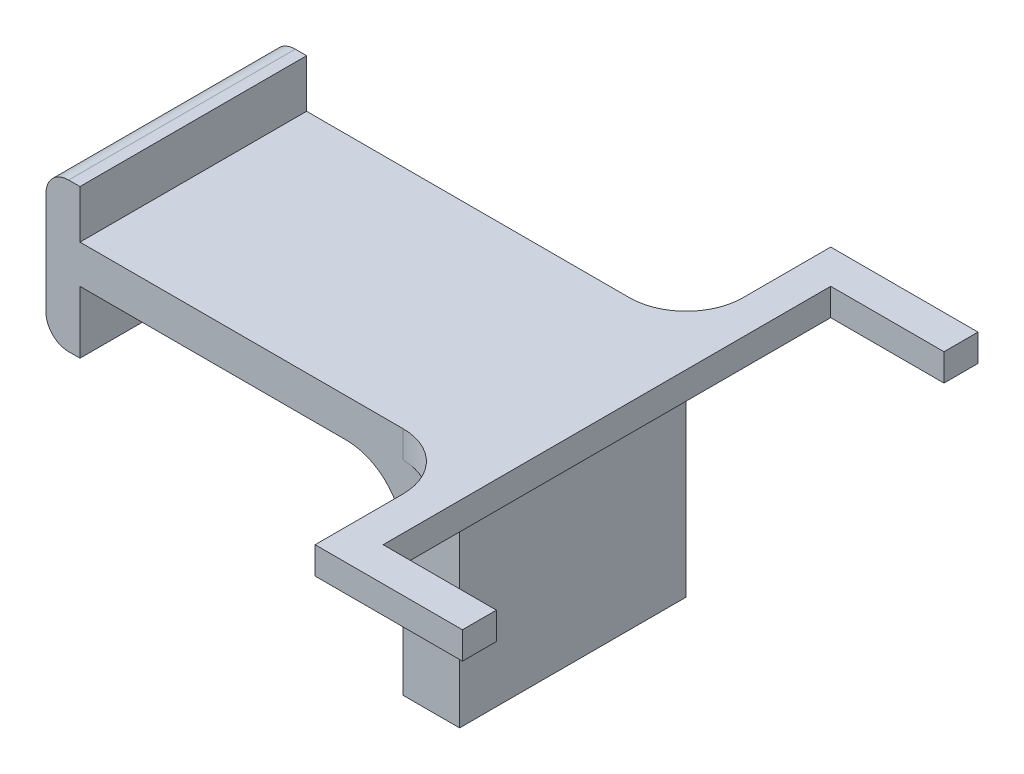
ISO-10303-21;
HEADER;
FILE_DESCRIPTION(('STEP AP214'),'2;1');
FILE_NAME('part.step','',(''),(''),'','','');
FILE_SCHEMA(('AUTOMOTIVE_DESIGN { 1 0 10303 214 1 1 1 1 }'));
ENDSEC;
DATA;
#1=APPLICATION_CONTEXT('core data for automotive mechanical design processes');
#2=APPLICATION_PROTOCOL_DEFINITION('international standard','automotive_design',2000,#1);
#3=PRODUCT_CONTEXT('',#1,'mechanical');
#4=PRODUCT('Part','Part','',(#3));
#5=PRODUCT_RELATED_PRODUCT_CATEGORY('part','',(#4));
#6=PRODUCT_DEFINITION_FORMATION('','',#4);
#7=PRODUCT_DEFINITION_CONTEXT('part definition',#1,'design');
#8=PRODUCT_DEFINITION('design','',#6,#7);
#9=PRODUCT_DEFINITION_SHAPE('','',#8);
#10=(LENGTH_UNIT() NAMED_UNIT(*) SI_UNIT(.MILLI.,.METRE.));
#11=(NAMED_UNIT(*) PLANE_ANGLE_UNIT() SI_UNIT($,.RADIAN.));
#12=(NAMED_UNIT(*) SI_UNIT($,.STERADIAN.) SOLID_ANGLE_UNIT());
#13=UNCERTAINTY_MEASURE_WITH_UNIT(LENGTH_MEASURE(1.E-05),#10,'distance_accuracy_value','');
#14=(GEOMETRIC_REPRESENTATION_CONTEXT(3) GLOBAL_UNCERTAINTY_ASSIGNED_CONTEXT((#13)) GLOBAL_UNIT_ASSIGNED_CONTEXT((#10,
#11,#12)) REPRESENTATION_CONTEXT('',''));
#15=CARTESIAN_POINT('',(0.,0.,0.));
#16=DIRECTION('',(0.,0.,1.));
#17=DIRECTION('',(1.,0.,0.));
#18=AXIS2_PLACEMENT_3D('',#15,#16,#17);
#19=CARTESIAN_POINT('',(0.,-2.4,-10.));
#20=DIRECTION('',(0.,0.,-1.));
#21=DIRECTION('',(-1.,0.,0.));
#22=AXIS2_PLACEMENT_3D('',#19,#20,#21);
#23=PLANE('',#22);
#24=DIRECTION('',(-1.,0.,0.));
#25=VECTOR('',#24,1.);
#26=CARTESIAN_POINT('',(-46.5,-8.875,-10.));
#27=LINE('',#26,#25);
#28=CARTESIAN_POINT('',(-46.5,-8.875,-10.));
#29=VERTEX_POINT('',#28);
#30=CARTESIAN_POINT('',(-47.5,-8.875,-10.));
#31=VERTEX_POINT('',#30);
#32=EDGE_CURVE('E265',#29,#31,#27,.T.);
#33=ORIENTED_EDGE('',*,*,#32,.T.);
#34=CARTESIAN_POINT('',(-47.5,-6.875,-10.));
#35=DIRECTION('',(0.,0.,-1.));
#36=DIRECTION('',(-1.,0.,0.));
#37=AXIS2_PLACEMENT_3D('',#34,#35,#36);
#38=CIRCLE('',#37,2.);
#39=CARTESIAN_POINT('',(-49.5,-6.875,-10.));
#40=VERTEX_POINT('',#39);
#41=EDGE_CURVE('E390',#31,#40,#38,.T.);
#42=ORIENTED_EDGE('',*,*,#41,.T.);
#43=DIRECTION('',(0.,1.,0.));
#44=VECTOR('',#43,1.);
#45=CARTESIAN_POINT('',(-49.5,-8.875,-10.));
#46=LINE('',#45,#44);
#47=CARTESIAN_POINT('',(-49.5,2.25,-10.));
#48=VERTEX_POINT('',#47);
#49=EDGE_CURVE('E268',#40,#48,#46,.T.);
#50=ORIENTED_EDGE('',*,*,#49,.T.);
#51=CARTESIAN_POINT('',(-47.5,2.25,-10.));
#52=DIRECTION('',(0.,0.,-1.));
#53=DIRECTION('',(-1.,0.,0.));
#54=AXIS2_PLACEMENT_3D('',#51,#52,#53);
#55=CIRCLE('',#54,2.);
#56=CARTESIAN_POINT('',(-47.5,4.25,-10.));
#57=VERTEX_POINT('',#56);
#58=EDGE_CURVE('E388',#48,#57,#55,.T.);
#59=ORIENTED_EDGE('',*,*,#58,.T.);
#60=DIRECTION('',(1.,0.,0.));
#61=VECTOR('',#60,1.);
#62=CARTESIAN_POINT('',(-49.5,4.25,-10.));
#63=LINE('',#62,#61);
#64=CARTESIAN_POINT('',(-46.5,4.25,-10.));
#65=VERTEX_POINT('',#64);
#66=EDGE_CURVE('E233',#57,#65,#63,.T.);
#67=ORIENTED_EDGE('',*,*,#66,.T.);
#68=DIRECTION('',(0.,-1.,0.));
#69=VECTOR('',#68,1.);
#70=CARTESIAN_POINT('',(-46.5,4.25,-10.));
#71=LINE('',#70,#69);
#72=CARTESIAN_POINT('',(-46.5,0.,-10.));
#73=VERTEX_POINT('',#72);
#74=EDGE_CURVE('E230',#65,#73,#71,.T.);
#75=ORIENTED_EDGE('',*,*,#74,.T.);
#76=DIRECTION('',(-1.,0.,0.));
#77=VECTOR('',#76,1.);
#78=CARTESIAN_POINT('',(0.,0.,-10.));
#79=LINE('',#78,#77);
#80=CARTESIAN_POINT('',(-18.,0.,-10.));
#81=VERTEX_POINT('',#80);
#82=EDGE_CURVE('E275',#81,#73,#79,.T.);
#83=ORIENTED_EDGE('',*,*,#82,.F.);
#84=DIRECTION('',(0.,1.,0.));
#85=VECTOR('',#84,1.);
#86=CARTESIAN_POINT('',(-18.,-2.4,-10.));
#87=LINE('',#86,#85);
#88=CARTESIAN_POINT('',(-18.,-2.4,-10.));
#89=VERTEX_POINT('',#88);
#90=EDGE_CURVE('E358',#81,#89,#87,.F.);
#91=ORIENTED_EDGE('',*,*,#90,.T.);
#92=DIRECTION('',(1.,0.,0.));
#93=VECTOR('',#92,1.);
#94=CARTESIAN_POINT('',(0.,-2.4,-10.));
#95=LINE('',#94,#93);
#96=CARTESIAN_POINT('',(-13.,-2.4,-10.));
#97=VERTEX_POINT('',#96);
#98=EDGE_CURVE('E356',#89,#97,#95,.T.);
#99=ORIENTED_EDGE('',*,*,#98,.T.);
#100=DIRECTION('',(0.,-1.,0.));
#101=VECTOR('',#100,1.);
#102=CARTESIAN_POINT('',(-13.,-2.4,-10.));
#103=LINE('',#102,#101);
#104=CARTESIAN_POINT('',(-13.,-20.38,-10.));
#105=VERTEX_POINT('',#104);
#106=EDGE_CURVE('E253',#97,#105,#103,.T.);
#107=ORIENTED_EDGE('',*,*,#106,.T.);
#108=DIRECTION('',(-1.,0.,0.));
#109=VECTOR('',#108,1.);
#110=CARTESIAN_POINT('',(-13.,-20.38,-10.));
#111=LINE('',#110,#109);
#112=CARTESIAN_POINT('',(-18.,-20.38,-10.));
#113=VERTEX_POINT('',#112);
#114=EDGE_CURVE('E211',#105,#113,#111,.T.);
#115=ORIENTED_EDGE('',*,*,#114,.T.);
#116=DIRECTION('',(0.,1.,0.));
#117=VECTOR('',#116,1.);
#118=CARTESIAN_POINT('',(-18.,-20.38,-10.));
#119=LINE('',#118,#117);
#120=CARTESIAN_POINT('',(-18.,-8.38,-10.));
#121=VERTEX_POINT('',#120);
#122=EDGE_CURVE('E256',#113,#121,#119,.T.);
#123=ORIENTED_EDGE('',*,*,#122,.T.);
#124=CARTESIAN_POINT('',(-23.,-8.38,-10.));
#125=DIRECTION('',(0.,0.,-1.));
#126=DIRECTION('',(-1.,0.,0.));
#127=AXIS2_PLACEMENT_3D('',#124,#125,#126);
#128=CIRCLE('',#127,5.);
#129=CARTESIAN_POINT('',(-23.,-3.38,-10.));
#130=VERTEX_POINT('',#129);
#131=EDGE_CURVE('E381',#121,#130,#128,.F.);
#132=ORIENTED_EDGE('',*,*,#131,.T.);
#133=DIRECTION('',(1.,0.,0.));
#134=VECTOR('',#133,1.);
#135=CARTESIAN_POINT('',(-46.5,-3.38,-10.));
#136=LINE('',#135,#134);
#137=CARTESIAN_POINT('',(-46.5,-3.38,-10.));
#138=VERTEX_POINT('',#137);
#139=EDGE_CURVE('E259',#138,#130,#136,.T.);
#140=ORIENTED_EDGE('',*,*,#139,.F.);
#141=DIRECTION('',(0.,-1.,0.));
#142=VECTOR('',#141,1.);
#143=CARTESIAN_POINT('',(-46.5,-3.38,-10.));
#144=LINE('',#143,#142);
#145=EDGE_CURVE('E262',#138,#29,#144,.T.);
#146=ORIENTED_EDGE('',*,*,#145,.T.);
#147=EDGE_LOOP('',(#33,#42,#50,#59,#67,#75,#83,#91,#99,#107,#115,#123,#132,#140,#146));
#148=FACE_BOUND('',#147,.T.);
#149=ADVANCED_FACE('F39',(#148),#23,.T.);
#150=CARTESIAN_POINT('',(-13.,-2.4,0.));
#151=DIRECTION('',(-1.,0.,0.));
#152=DIRECTION('',(0.,0.,1.));
#153=AXIS2_PLACEMENT_3D('',#150,#151,#152);
#154=PLANE('',#153);
#155=DIRECTION('',(0.,0.,1.));
#156=VECTOR('',#155,1.);
#157=CARTESIAN_POINT('',(-13.,-2.4,0.));
#158=LINE('',#157,#156);
#159=CARTESIAN_POINT('',(-13.,-2.4,-22.75));
#160=VERTEX_POINT('',#159);
#161=CARTESIAN_POINT('',(-13.,-2.4,-15.));
#162=VERTEX_POINT('',#161);
#163=EDGE_CURVE('E286',#160,#162,#158,.T.);
#164=ORIENTED_EDGE('',*,*,#163,.T.);
#165=DIRECTION('',(0.,1.,0.));
#166=VECTOR('',#165,1.);
#167=CARTESIAN_POINT('',(-13.,0.,-15.));
#168=LINE('',#167,#166);
#169=CARTESIAN_POINT('',(-13.,0.,-15.));
#170=VERTEX_POINT('',#169);
#171=EDGE_CURVE('E338',#162,#170,#168,.T.);
#172=ORIENTED_EDGE('',*,*,#171,.T.);
#173=DIRECTION('',(0.,0.,1.));
#174=VECTOR('',#173,1.);
#175=CARTESIAN_POINT('',(-13.,0.,0.));
#176=LINE('',#175,#174);
#177=CARTESIAN_POINT('',(-13.,0.,-22.75));
#178=VERTEX_POINT('',#177);
#179=EDGE_CURVE('E285',#178,#170,#176,.T.);
#180=ORIENTED_EDGE('',*,*,#179,.F.);
#181=DIRECTION('',(0.,1.,0.));
#182=VECTOR('',#181,1.);
#183=CARTESIAN_POINT('',(-13.,-2.4,-22.75));
#184=LINE('',#183,#182);
#185=EDGE_CURVE('E336',#160,#178,#184,.T.);
#186=ORIENTED_EDGE('',*,*,#185,.F.);
#187=EDGE_LOOP('',(#164,#172,#180,#186));
#188=FACE_BOUND('',#187,.T.);
#189=ADVANCED_FACE('F434',(#188),#154,.T.);
#190=CARTESIAN_POINT('',(0.,-2.4,-22.75));
#191=DIRECTION('',(0.,0.,-1.));
#192=DIRECTION('',(-1.,0.,0.));
#193=AXIS2_PLACEMENT_3D('',#190,#191,#192);
#194=PLANE('',#193);
#195=DIRECTION('',(-1.,0.,0.));
#196=VECTOR('',#195,1.);
#197=CARTESIAN_POINT('',(0.,0.,-22.75));
#198=LINE('',#197,#196);
#199=CARTESIAN_POINT('',(0.,0.,-22.75));
#200=VERTEX_POINT('',#199);
#201=EDGE_CURVE('E333',#200,#178,#198,.T.);
#202=ORIENTED_EDGE('',*,*,#201,.F.);
#203=DIRECTION('',(0.,1.,0.));
#204=VECTOR('',#203,1.);
#205=CARTESIAN_POINT('',(0.,-2.4,-22.75));
#206=LINE('',#205,#204);
#207=CARTESIAN_POINT('',(0.,-2.4,-22.75));
#208=VERTEX_POINT('',#207);
#209=EDGE_CURVE('E339',#208,#200,#206,.T.);
#210=ORIENTED_EDGE('',*,*,#209,.F.);
#211=DIRECTION('',(-1.,0.,0.));
#212=VECTOR('',#211,1.);
#213=CARTESIAN_POINT('',(0.,-2.4,-22.75));
#214=LINE('',#213,#212);
#215=EDGE_CURVE('E304',#208,#160,#214,.T.);
#216=ORIENTED_EDGE('',*,*,#215,.T.);
#217=ORIENTED_EDGE('',*,*,#185,.T.);
#218=EDGE_LOOP('',(#202,#210,#216,#217));
#219=FACE_BOUND('',#218,.T.);
#220=ADVANCED_FACE('F439',(#219),#194,.T.);
#221=CARTESIAN_POINT('',(0.,-2.4,0.));
#222=DIRECTION('',(1.,0.,0.));
#223=DIRECTION('',(0.,0.,-1.));
#224=AXIS2_PLACEMENT_3D('',#221,#222,#223);
#225=PLANE('',#224);
#226=DIRECTION('',(0.,0.,-1.));
#227=VECTOR('',#226,1.);
#228=CARTESIAN_POINT('',(0.,0.,0.));
#229=LINE('',#228,#227);
#230=CARTESIAN_POINT('',(0.,0.,-19.75));
#231=VERTEX_POINT('',#230);
#232=EDGE_CURVE('E330',#231,#200,#229,.T.);
#233=ORIENTED_EDGE('',*,*,#232,.F.);
#234=DIRECTION('',(0.,1.,0.));
#235=VECTOR('',#234,1.);
#236=CARTESIAN_POINT('',(0.,-2.4,-19.75));
#237=LINE('',#236,#235);
#238=CARTESIAN_POINT('',(0.,-2.4,-19.75));
#239=VERTEX_POINT('',#238);
#240=EDGE_CURVE('E341',#239,#231,#237,.T.);
#241=ORIENTED_EDGE('',*,*,#240,.F.);
#242=DIRECTION('',(0.,0.,-1.));
#243=VECTOR('',#242,1.);
#244=CARTESIAN_POINT('',(0.,-2.4,0.));
#245=LINE('',#244,#243);
#246=EDGE_CURVE('E301',#239,#208,#245,.T.);
#247=ORIENTED_EDGE('',*,*,#246,.T.);
#248=ORIENTED_EDGE('',*,*,#209,.T.);
#249=EDGE_LOOP('',(#233,#241,#247,#248));
#250=FACE_BOUND('',#249,.T.);
#251=ADVANCED_FACE('F444',(#250),#225,.T.);
#252=CARTESIAN_POINT('',(0.,-2.4,-19.75));
#253=DIRECTION('',(0.,0.,1.));
#254=DIRECTION('',(1.,0.,0.));
#255=AXIS2_PLACEMENT_3D('',#252,#253,#254);
#256=PLANE('',#255);
#257=DIRECTION('',(1.,0.,0.));
#258=VECTOR('',#257,1.);
#259=CARTESIAN_POINT('',(0.,0.,-19.75));
#260=LINE('',#259,#258);
#261=CARTESIAN_POINT('',(-9.99999999999999,0.,-19.75));
#262=VERTEX_POINT('',#261);
#263=EDGE_CURVE('E327',#262,#231,#260,.T.);
#264=ORIENTED_EDGE('',*,*,#263,.F.);
#265=DIRECTION('',(0.,1.,0.));
#266=VECTOR('',#265,1.);
#267=CARTESIAN_POINT('',(-9.99999999999999,-2.4,-19.75));
#268=LINE('',#267,#266);
#269=CARTESIAN_POINT('',(-9.99999999999999,-2.4,-19.75));
#270=VERTEX_POINT('',#269);
#271=EDGE_CURVE('E343',#270,#262,#268,.T.);
#272=ORIENTED_EDGE('',*,*,#271,.F.);
#273=DIRECTION('',(1.,0.,0.));
#274=VECTOR('',#273,1.);
#275=CARTESIAN_POINT('',(0.,-2.4,-19.75));
#276=LINE('',#275,#274);
#277=EDGE_CURVE('E298',#270,#239,#276,.T.);
#278=ORIENTED_EDGE('',*,*,#277,.T.);
#279=ORIENTED_EDGE('',*,*,#240,.T.);
#280=EDGE_LOOP('',(#264,#272,#278,#279));
#281=FACE_BOUND('',#280,.T.);
#282=ADVANCED_FACE('F447',(#281),#256,.T.);
#283=CARTESIAN_POINT('',(-9.99999999999999,-2.4,0.));
#284=DIRECTION('',(1.,0.,0.));
#285=DIRECTION('',(0.,0.,-1.));
#286=AXIS2_PLACEMENT_3D('',#283,#284,#285);
#287=PLANE('',#286);
#288=DIRECTION('',(0.,0.,-1.));
#289=VECTOR('',#288,1.);
#290=CARTESIAN_POINT('',(-9.99999999999999,0.,0.));
#291=LINE('',#290,#289);
#292=CARTESIAN_POINT('',(-9.99999999999999,0.,19.75));
#293=VERTEX_POINT('',#292);
#294=EDGE_CURVE('E324',#293,#262,#291,.T.);
#295=ORIENTED_EDGE('',*,*,#294,.F.);
#296=DIRECTION('',(0.,1.,0.));
#297=VECTOR('',#296,1.);
#298=CARTESIAN_POINT('',(-9.99999999999999,-2.4,19.75));
#299=LINE('',#298,#297);
#300=CARTESIAN_POINT('',(-9.99999999999999,-2.4,19.75));
#301=VERTEX_POINT('',#300);
#302=EDGE_CURVE('E345',#301,#293,#299,.T.);
#303=ORIENTED_EDGE('',*,*,#302,.F.);
#304=DIRECTION('',(0.,0.,-1.));
#305=VECTOR('',#304,1.);
#306=CARTESIAN_POINT('',(-9.99999999999999,-2.4,0.));
#307=LINE('',#306,#305);
#308=EDGE_CURVE('E295',#301,#270,#307,.T.);
#309=ORIENTED_EDGE('',*,*,#308,.T.);
#310=ORIENTED_EDGE('',*,*,#271,.T.);
#311=EDGE_LOOP('',(#295,#303,#309,#310));
#312=FACE_BOUND('',#311,.T.);
#313=ADVANCED_FACE('F452',(#312),#287,.T.);
#314=CARTESIAN_POINT('',(0.,-2.4,19.75));
#315=DIRECTION('',(0.,0.,-1.));
#316=DIRECTION('',(-1.,0.,0.));
#317=AXIS2_PLACEMENT_3D('',#314,#315,#316);
#318=PLANE('',#317);
#319=DIRECTION('',(-1.,0.,0.));
#320=VECTOR('',#319,1.);
#321=CARTESIAN_POINT('',(0.,0.,19.75));
#322=LINE('',#321,#320);
#323=CARTESIAN_POINT('',(0.,0.,19.75));
#324=VERTEX_POINT('',#323);
#325=EDGE_CURVE('E321',#324,#293,#322,.T.);
#326=ORIENTED_EDGE('',*,*,#325,.F.);
#327=DIRECTION('',(0.,1.,0.));
#328=VECTOR('',#327,1.);
#329=CARTESIAN_POINT('',(0.,-2.4,19.75));
#330=LINE('',#329,#328);
#331=CARTESIAN_POINT('',(0.,-2.4,19.75));
#332=VERTEX_POINT('',#331);
#333=EDGE_CURVE('E347',#332,#324,#330,.T.);
#334=ORIENTED_EDGE('',*,*,#333,.F.);
#335=DIRECTION('',(-1.,0.,0.));
#336=VECTOR('',#335,1.);
#337=CARTESIAN_POINT('',(0.,-2.4,19.75));
#338=LINE('',#337,#336);
#339=EDGE_CURVE('E292',#332,#301,#338,.T.);
#340=ORIENTED_EDGE('',*,*,#339,.T.);
#341=ORIENTED_EDGE('',*,*,#302,.T.);
#342=EDGE_LOOP('',(#326,#334,#340,#341));
#343=FACE_BOUND('',#342,.T.);
#344=ADVANCED_FACE('F455',(#343),#318,.T.);
#345=CARTESIAN_POINT('',(0.,-2.4,0.));
#346=DIRECTION('',(1.,0.,0.));
#347=DIRECTION('',(0.,0.,-1.));
#348=AXIS2_PLACEMENT_3D('',#345,#346,#347);
#349=PLANE('',#348);
#350=DIRECTION('',(0.,0.,-1.));
#351=VECTOR('',#350,1.);
#352=CARTESIAN_POINT('',(0.,0.,0.));
#353=LINE('',#352,#351);
#354=CARTESIAN_POINT('',(0.,0.,22.75));
#355=VERTEX_POINT('',#354);
#356=EDGE_CURVE('E318',#355,#324,#353,.T.);
#357=ORIENTED_EDGE('',*,*,#356,.F.);
#358=DIRECTION('',(0.,1.,0.));
#359=VECTOR('',#358,1.);
#360=CARTESIAN_POINT('',(0.,-2.4,22.75));
#361=LINE('',#360,#359);
#362=CARTESIAN_POINT('',(0.,-2.4,22.75));
#363=VERTEX_POINT('',#362);
#364=EDGE_CURVE('E349',#363,#355,#361,.T.);
#365=ORIENTED_EDGE('',*,*,#364,.F.);
#366=DIRECTION('',(0.,0.,-1.));
#367=VECTOR('',#366,1.);
#368=CARTESIAN_POINT('',(0.,-2.4,0.));
#369=LINE('',#368,#367);
#370=EDGE_CURVE('E289',#363,#332,#369,.T.);
#371=ORIENTED_EDGE('',*,*,#370,.T.);
#372=ORIENTED_EDGE('',*,*,#333,.T.);
#373=EDGE_LOOP('',(#357,#365,#371,#372));
#374=FACE_BOUND('',#373,.T.);
#375=ADVANCED_FACE('F460',(#374),#349,.T.);
#376=CARTESIAN_POINT('',(0.,-2.4,22.75));
#377=DIRECTION('',(0.,0.,1.));
#378=DIRECTION('',(1.,0.,0.));
#379=AXIS2_PLACEMENT_3D('',#376,#377,#378);
#380=PLANE('',#379);
#381=DIRECTION('',(1.,0.,0.));
#382=VECTOR('',#381,1.);
#383=CARTESIAN_POINT('',(0.,0.,22.75));
#384=LINE('',#383,#382);
#385=CARTESIAN_POINT('',(-13.,0.,22.75));
#386=VERTEX_POINT('',#385);
#387=EDGE_CURVE('E315',#386,#355,#384,.T.);
#388=ORIENTED_EDGE('',*,*,#387,.F.);
#389=DIRECTION('',(0.,1.,0.));
#390=VECTOR('',#389,1.);
#391=CARTESIAN_POINT('',(-13.,-2.4,22.75));
#392=LINE('',#391,#390);
#393=CARTESIAN_POINT('',(-13.,-2.4,22.75));
#394=VERTEX_POINT('',#393);
#395=EDGE_CURVE('E351',#394,#386,#392,.T.);
#396=ORIENTED_EDGE('',*,*,#395,.F.);
#397=DIRECTION('',(1.,0.,0.));
#398=VECTOR('',#397,1.);
#399=CARTESIAN_POINT('',(0.,-2.4,22.75));
#400=LINE('',#399,#398);
#401=EDGE_CURVE('E284',#394,#363,#400,.T.);
#402=ORIENTED_EDGE('',*,*,#401,.T.);
#403=ORIENTED_EDGE('',*,*,#364,.T.);
#404=EDGE_LOOP('',(#388,#396,#402,#403));
#405=FACE_BOUND('',#404,.T.);
#406=ADVANCED_FACE('F463',(#405),#380,.T.);
#407=CARTESIAN_POINT('',(-13.,0.,15.));
#408=VERTEX_POINT('',#407);
#409=EDGE_CURVE('E313',#408,#386,#176,.T.);
#410=ORIENTED_EDGE('',*,*,#409,.F.);
#411=DIRECTION('',(0.,1.,0.));
#412=VECTOR('',#411,1.);
#413=CARTESIAN_POINT('',(-13.,-2.4,15.));
#414=LINE('',#413,#412);
#415=CARTESIAN_POINT('',(-13.,-2.4,15.));
#416=VERTEX_POINT('',#415);
#417=EDGE_CURVE('E366',#408,#416,#414,.F.);
#418=ORIENTED_EDGE('',*,*,#417,.T.);
#419=EDGE_CURVE('E282',#416,#394,#158,.T.);
#420=ORIENTED_EDGE('',*,*,#419,.T.);
#421=ORIENTED_EDGE('',*,*,#395,.T.);
#422=EDGE_LOOP('',(#410,#418,#420,#421));
#423=FACE_BOUND('',#422,.T.);
#424=ADVANCED_FACE('F474',(#423),#154,.T.);
#425=CARTESIAN_POINT('',(0.,-2.4,10.));
#426=DIRECTION('',(0.,0.,-1.));
#427=DIRECTION('',(-1.,0.,0.));
#428=AXIS2_PLACEMENT_3D('',#425,#426,#427);
#429=PLANE('',#428);
#430=DIRECTION('',(0.,1.,0.));
#431=VECTOR('',#430,1.);
#432=CARTESIAN_POINT('',(-49.5,-8.875,10.));
#433=LINE('',#432,#431);
#434=CARTESIAN_POINT('',(-49.5,-6.875,10.));
#435=VERTEX_POINT('',#434);
#436=CARTESIAN_POINT('',(-49.5,2.25,10.));
#437=VERTEX_POINT('',#436);
#438=EDGE_CURVE('E246',#435,#437,#433,.T.);
#439=ORIENTED_EDGE('',*,*,#438,.F.);
#440=CARTESIAN_POINT('',(-47.5,-6.875,10.));
#441=DIRECTION('',(0.,0.,-1.));
#442=DIRECTION('',(-1.,0.,0.));
#443=AXIS2_PLACEMENT_3D('',#440,#441,#442);
#444=CIRCLE('',#443,2.);
#445=CARTESIAN_POINT('',(-47.5,-8.875,10.));
#446=VERTEX_POINT('',#445);
#447=EDGE_CURVE('E47',#435,#446,#444,.F.);
#448=ORIENTED_EDGE('',*,*,#447,.T.);
#449=DIRECTION('',(-1.,0.,0.));
#450=VECTOR('',#449,1.);
#451=CARTESIAN_POINT('',(-46.5,-8.875,10.));
#452=LINE('',#451,#450);
#453=CARTESIAN_POINT('',(-46.5,-8.875,10.));
#454=VERTEX_POINT('',#453);
#455=EDGE_CURVE('E243',#454,#446,#452,.T.);
#456=ORIENTED_EDGE('',*,*,#455,.F.);
#457=DIRECTION('',(0.,-1.,0.));
#458=VECTOR('',#457,1.);
#459=CARTESIAN_POINT('',(-46.5,-3.38,10.));
#460=LINE('',#459,#458);
#461=CARTESIAN_POINT('',(-46.5,-3.38,10.));
#462=VERTEX_POINT('',#461);
#463=EDGE_CURVE('E240',#462,#454,#460,.T.);
#464=ORIENTED_EDGE('',*,*,#463,.F.);
#465=DIRECTION('',(1.,0.,0.));
#466=VECTOR('',#465,1.);
#467=CARTESIAN_POINT('',(-46.5,-3.38,10.));
#468=LINE('',#467,#466);
#469=CARTESIAN_POINT('',(-23.,-3.38,10.));
#470=VERTEX_POINT('',#469);
#471=EDGE_CURVE('E237',#462,#470,#468,.T.);
#472=ORIENTED_EDGE('',*,*,#471,.T.);
#473=CARTESIAN_POINT('',(-23.,-8.38,10.));
#474=DIRECTION('',(0.,0.,-1.));
#475=DIRECTION('',(-1.,0.,0.));
#476=AXIS2_PLACEMENT_3D('',#473,#474,#475);
#477=CIRCLE('',#476,5.);
#478=CARTESIAN_POINT('',(-18.,-8.38,10.));
#479=VERTEX_POINT('',#478);
#480=EDGE_CURVE('E383',#470,#479,#477,.T.);
#481=ORIENTED_EDGE('',*,*,#480,.T.);
#482=DIRECTION('',(0.,1.,0.));
#483=VECTOR('',#482,1.);
#484=CARTESIAN_POINT('',(-18.,-20.38,10.));
#485=LINE('',#484,#483);
#486=CARTESIAN_POINT('',(-18.,-20.38,10.));
#487=VERTEX_POINT('',#486);
#488=EDGE_CURVE('E226',#487,#479,#485,.T.);
#489=ORIENTED_EDGE('',*,*,#488,.F.);
#490=DIRECTION('',(-1.,0.,0.));
#491=VECTOR('',#490,1.);
#492=CARTESIAN_POINT('',(-13.,-20.38,10.));
#493=LINE('',#492,#491);
#494=CARTESIAN_POINT('',(-13.,-20.38,10.));
#495=VERTEX_POINT('',#494);
#496=EDGE_CURVE('E209',#495,#487,#493,.T.);
#497=ORIENTED_EDGE('',*,*,#496,.F.);
#498=DIRECTION('',(0.,-1.,0.));
#499=VECTOR('',#498,1.);
#500=CARTESIAN_POINT('',(-13.,-2.4,10.));
#501=LINE('',#500,#499);
#502=CARTESIAN_POINT('',(-13.,-2.4,10.));
#503=VERTEX_POINT('',#502);
#504=EDGE_CURVE('E223',#503,#495,#501,.T.);
#505=ORIENTED_EDGE('',*,*,#504,.F.);
#506=DIRECTION('',(-1.,0.,0.));
#507=VECTOR('',#506,1.);
#508=CARTESIAN_POINT('',(0.,-2.4,10.));
#509=LINE('',#508,#507);
#510=CARTESIAN_POINT('',(-18.,-2.4,10.));
#511=VERTEX_POINT('',#510);
#512=EDGE_CURVE('E361',#503,#511,#509,.T.);
#513=ORIENTED_EDGE('',*,*,#512,.T.);
#514=DIRECTION('',(0.,1.,0.));
#515=VECTOR('',#514,1.);
#516=CARTESIAN_POINT('',(-18.,-2.4,10.));
#517=LINE('',#516,#515);
#518=CARTESIAN_POINT('',(-18.,0.,10.));
#519=VERTEX_POINT('',#518);
#520=EDGE_CURVE('E363',#511,#519,#517,.T.);
#521=ORIENTED_EDGE('',*,*,#520,.T.);
#522=DIRECTION('',(-1.,0.,0.));
#523=VECTOR('',#522,1.);
#524=CARTESIAN_POINT('',(0.,0.,10.));
#525=LINE('',#524,#523);
#526=CARTESIAN_POINT('',(-46.5,0.,10.));
#527=VERTEX_POINT('',#526);
#528=EDGE_CURVE('E311',#519,#527,#525,.T.);
#529=ORIENTED_EDGE('',*,*,#528,.T.);
#530=DIRECTION('',(0.,-1.,0.));
#531=VECTOR('',#530,1.);
#532=CARTESIAN_POINT('',(-46.5,4.25,10.));
#533=LINE('',#532,#531);
#534=CARTESIAN_POINT('',(-46.5,4.25,10.));
#535=VERTEX_POINT('',#534);
#536=EDGE_CURVE('E250',#535,#527,#533,.T.);
#537=ORIENTED_EDGE('',*,*,#536,.F.);
#538=DIRECTION('',(1.,0.,0.));
#539=VECTOR('',#538,1.);
#540=CARTESIAN_POINT('',(-49.5,4.25,10.));
#541=LINE('',#540,#539);
#542=CARTESIAN_POINT('',(-47.5,4.25,10.));
#543=VERTEX_POINT('',#542);
#544=EDGE_CURVE('E248',#543,#535,#541,.T.);
#545=ORIENTED_EDGE('',*,*,#544,.F.);
#546=CARTESIAN_POINT('',(-47.5,2.25,10.));
#547=DIRECTION('',(0.,0.,-1.));
#548=DIRECTION('',(-1.,0.,0.));
#549=AXIS2_PLACEMENT_3D('',#546,#547,#548);
#550=CIRCLE('',#549,2.);
#551=EDGE_CURVE('E59',#543,#437,#550,.F.);
#552=ORIENTED_EDGE('',*,*,#551,.T.);
#553=EDGE_LOOP('',(#439,#448,#456,#464,#472,#481,#489,#497,#505,#513,#521,#529,#537,#545,#552));
#554=FACE_BOUND('',#553,.T.);
#555=ADVANCED_FACE('F221',(#554),#429,.F.);
#556=CARTESIAN_POINT('',(0.,-2.4,0.));
#557=DIRECTION('',(0.,1.,0.));
#558=DIRECTION('',(0.,0.,1.));
#559=AXIS2_PLACEMENT_3D('',#556,#557,#558);
#560=PLANE('',#559);
#561=ORIENTED_EDGE('',*,*,#419,.F.);
#562=CARTESIAN_POINT('',(-18.,-2.4,15.));
#563=DIRECTION('',(0.,1.,0.));
#564=DIRECTION('',(0.,0.,1.));
#565=AXIS2_PLACEMENT_3D('',#562,#563,#564);
#566=CIRCLE('',#565,5.);
#567=EDGE_CURVE('E374',#416,#511,#566,.T.);
#568=ORIENTED_EDGE('',*,*,#567,.T.);
#569=ORIENTED_EDGE('',*,*,#512,.F.);
#570=DIRECTION('',(0.,0.,-1.));
#571=VECTOR('',#570,1.);
#572=CARTESIAN_POINT('',(-13.,-2.4,10.));
#573=LINE('',#572,#571);
#574=EDGE_CURVE('E217',#503,#97,#573,.T.);
#575=ORIENTED_EDGE('',*,*,#574,.T.);
#576=ORIENTED_EDGE('',*,*,#98,.F.);
#577=CARTESIAN_POINT('',(-18.,-2.4,-15.));
#578=DIRECTION('',(0.,1.,0.));
#579=DIRECTION('',(0.,0.,1.));
#580=AXIS2_PLACEMENT_3D('',#577,#578,#579);
#581=CIRCLE('',#580,5.);
#582=EDGE_CURVE('E370',#89,#162,#581,.T.);
#583=ORIENTED_EDGE('',*,*,#582,.T.);
#584=ORIENTED_EDGE('',*,*,#163,.F.);
#585=ORIENTED_EDGE('',*,*,#215,.F.);
#586=ORIENTED_EDGE('',*,*,#246,.F.);
#587=ORIENTED_EDGE('',*,*,#277,.F.);
#588=ORIENTED_EDGE('',*,*,#308,.F.);
#589=ORIENTED_EDGE('',*,*,#339,.F.);
#590=ORIENTED_EDGE('',*,*,#370,.F.);
#591=ORIENTED_EDGE('',*,*,#401,.F.);
#592=EDGE_LOOP('',(#561,#568,#569,#575,#576,#583,#584,#585,#586,#587,#588,#589,#590,#591));
#593=FACE_BOUND('',#592,.T.);
#594=ADVANCED_FACE('F431',(#593),#560,.F.);
#595=CARTESIAN_POINT('',(0.,0.,0.));
#596=DIRECTION('',(0.,1.,0.));
#597=DIRECTION('',(0.,0.,1.));
#598=AXIS2_PLACEMENT_3D('',#595,#596,#597);
#599=PLANE('',#598);
#600=ORIENTED_EDGE('',*,*,#179,.T.);
#601=CARTESIAN_POINT('',(-18.,0.,-15.));
#602=DIRECTION('',(0.,1.,0.));
#603=DIRECTION('',(0.,0.,1.));
#604=AXIS2_PLACEMENT_3D('',#601,#602,#603);
#605=CIRCLE('',#604,5.);
#606=EDGE_CURVE('E368',#170,#81,#605,.F.);
#607=ORIENTED_EDGE('',*,*,#606,.T.);
#608=ORIENTED_EDGE('',*,*,#82,.T.);
#609=DIRECTION('',(0.,0.,1.));
#610=VECTOR('',#609,1.);
#611=CARTESIAN_POINT('',(-46.5,0.,0.));
#612=LINE('',#611,#610);
#613=EDGE_CURVE('E308',#73,#527,#612,.T.);
#614=ORIENTED_EDGE('',*,*,#613,.T.);
#615=ORIENTED_EDGE('',*,*,#528,.F.);
#616=CARTESIAN_POINT('',(-18.,0.,15.));
#617=DIRECTION('',(0.,1.,0.));
#618=DIRECTION('',(0.,0.,1.));
#619=AXIS2_PLACEMENT_3D('',#616,#617,#618);
#620=CIRCLE('',#619,5.);
#621=EDGE_CURVE('E372',#519,#408,#620,.F.);
#622=ORIENTED_EDGE('',*,*,#621,.T.);
#623=ORIENTED_EDGE('',*,*,#409,.T.);
#624=ORIENTED_EDGE('',*,*,#387,.T.);
#625=ORIENTED_EDGE('',*,*,#356,.T.);
#626=ORIENTED_EDGE('',*,*,#325,.T.);
#627=ORIENTED_EDGE('',*,*,#294,.T.);
#628=ORIENTED_EDGE('',*,*,#263,.T.);
#629=ORIENTED_EDGE('',*,*,#232,.T.);
#630=ORIENTED_EDGE('',*,*,#201,.T.);
#631=EDGE_LOOP('',(#600,#607,#608,#614,#615,#622,#623,#624,#625,#626,#627,#628,#629,#630));
#632=FACE_BOUND('',#631,.T.);
#633=ADVANCED_FACE('F472',(#632),#599,.T.);
#634=CARTESIAN_POINT('',(-46.5,4.25,10.));
#635=DIRECTION('',(1.,0.,0.));
#636=DIRECTION('',(0.,0.,-1.));
#637=AXIS2_PLACEMENT_3D('',#634,#635,#636);
#638=PLANE('',#637);
#639=ORIENTED_EDGE('',*,*,#536,.T.);
#640=ORIENTED_EDGE('',*,*,#613,.F.);
#641=ORIENTED_EDGE('',*,*,#74,.F.);
#642=DIRECTION('',(0.,0.,-1.));
#643=VECTOR('',#642,1.);
#644=CARTESIAN_POINT('',(-46.5,4.25,10.));
#645=LINE('',#644,#643);
#646=EDGE_CURVE('E272',#535,#65,#645,.T.);
#647=ORIENTED_EDGE('',*,*,#646,.F.);
#648=EDGE_LOOP('',(#639,#640,#641,#647));
#649=FACE_BOUND('',#648,.T.);
#650=ADVANCED_FACE('F419',(#649),#638,.T.);
#651=CARTESIAN_POINT('',(-49.5,4.25,10.));
#652=DIRECTION('',(0.,1.,0.));
#653=DIRECTION('',(0.,0.,1.));
#654=AXIS2_PLACEMENT_3D('',#651,#652,#653);
#655=PLANE('',#654);
#656=ORIENTED_EDGE('',*,*,#66,.F.);
#657=DIRECTION('',(0.,0.,-1.));
#658=VECTOR('',#657,1.);
#659=CARTESIAN_POINT('',(-47.5,4.25,10.));
#660=LINE('',#659,#658);
#661=EDGE_CURVE('E11',#57,#543,#660,.F.);
#662=ORIENTED_EDGE('',*,*,#661,.T.);
#663=ORIENTED_EDGE('',*,*,#544,.T.);
#664=ORIENTED_EDGE('',*,*,#646,.T.);
#665=EDGE_LOOP('',(#656,#662,#663,#664));
#666=FACE_BOUND('',#665,.T.);
#667=ADVANCED_FACE('F413',(#666),#655,.T.);
#668=CARTESIAN_POINT('',(-49.5,-8.875,10.));
#669=DIRECTION('',(-1.,0.,0.));
#670=DIRECTION('',(0.,0.,1.));
#671=AXIS2_PLACEMENT_3D('',#668,#669,#670);
#672=PLANE('',#671);
#673=ORIENTED_EDGE('',*,*,#49,.F.);
#674=DIRECTION('',(0.,0.,-1.));
#675=VECTOR('',#674,1.);
#676=CARTESIAN_POINT('',(-49.5,-6.875,10.));
#677=LINE('',#676,#675);
#678=EDGE_CURVE('E395',#40,#435,#677,.F.);
#679=ORIENTED_EDGE('',*,*,#678,.T.);
#680=ORIENTED_EDGE('',*,*,#438,.T.);
#681=DIRECTION('',(0.,0.,-1.));
#682=VECTOR('',#681,1.);
#683=CARTESIAN_POINT('',(-49.5,2.25,10.));
#684=LINE('',#683,#682);
#685=EDGE_CURVE('E392',#437,#48,#684,.T.);
#686=ORIENTED_EDGE('',*,*,#685,.T.);
#687=EDGE_LOOP('',(#673,#679,#680,#686));
#688=FACE_BOUND('',#687,.T.);
#689=ADVANCED_FACE('F410',(#688),#672,.T.);
#690=CARTESIAN_POINT('',(-46.5,-8.875,10.));
#691=DIRECTION('',(0.,-1.,0.));
#692=DIRECTION('',(0.,0.,-1.));
#693=AXIS2_PLACEMENT_3D('',#690,#691,#692);
#694=PLANE('',#693);
#695=ORIENTED_EDGE('',*,*,#455,.T.);
#696=DIRECTION('',(0.,0.,-1.));
#697=VECTOR('',#696,1.);
#698=CARTESIAN_POINT('',(-47.5,-8.875,10.));
#699=LINE('',#698,#697);
#700=EDGE_CURVE('E385',#446,#31,#699,.T.);
#701=ORIENTED_EDGE('',*,*,#700,.T.);
#702=ORIENTED_EDGE('',*,*,#32,.F.);
#703=DIRECTION('',(0.,0.,-1.));
#704=VECTOR('',#703,1.);
#705=CARTESIAN_POINT('',(-46.5,-8.875,10.));
#706=LINE('',#705,#704);
#707=EDGE_CURVE('E276',#454,#29,#706,.T.);
#708=ORIENTED_EDGE('',*,*,#707,.F.);
#709=EDGE_LOOP('',(#695,#701,#702,#708));
#710=FACE_BOUND('',#709,.T.);
#711=ADVANCED_FACE('F404',(#710),#694,.T.);
#712=CARTESIAN_POINT('',(-46.5,-3.38,10.));
#713=DIRECTION('',(1.,0.,0.));
#714=DIRECTION('',(0.,0.,-1.));
#715=AXIS2_PLACEMENT_3D('',#712,#713,#714);
#716=PLANE('',#715);
#717=ORIENTED_EDGE('',*,*,#145,.F.);
#718=DIRECTION('',(0.,0.,-1.));
#719=VECTOR('',#718,1.);
#720=CARTESIAN_POINT('',(-46.5,-3.38,10.));
#721=LINE('',#720,#719);
#722=EDGE_CURVE('E278',#462,#138,#721,.T.);
#723=ORIENTED_EDGE('',*,*,#722,.F.);
#724=ORIENTED_EDGE('',*,*,#463,.T.);
#725=ORIENTED_EDGE('',*,*,#707,.T.);
#726=EDGE_LOOP('',(#717,#723,#724,#725));
#727=FACE_BOUND('',#726,.T.);
#728=ADVANCED_FACE('F520',(#727),#716,.T.);
#729=CARTESIAN_POINT('',(-46.5,-3.38,10.));
#730=DIRECTION('',(0.,1.,0.));
#731=DIRECTION('',(0.,0.,1.));
#732=AXIS2_PLACEMENT_3D('',#729,#730,#731);
#733=PLANE('',#732);
#734=ORIENTED_EDGE('',*,*,#139,.T.);
#735=DIRECTION('',(0.,0.,-1.));
#736=VECTOR('',#735,1.);
#737=CARTESIAN_POINT('',(-23.,-3.38,10.));
#738=LINE('',#737,#736);
#739=EDGE_CURVE('E379',#130,#470,#738,.F.);
#740=ORIENTED_EDGE('',*,*,#739,.T.);
#741=ORIENTED_EDGE('',*,*,#471,.F.);
#742=ORIENTED_EDGE('',*,*,#722,.T.);
#743=EDGE_LOOP('',(#734,#740,#741,#742));
#744=FACE_BOUND('',#743,.T.);
#745=ADVANCED_FACE('F574',(#744),#733,.F.);
#746=CARTESIAN_POINT('',(-18.,-20.38,10.));
#747=DIRECTION('',(-1.,0.,0.));
#748=DIRECTION('',(0.,0.,1.));
#749=AXIS2_PLACEMENT_3D('',#746,#747,#748);
#750=PLANE('',#749);
#751=ORIENTED_EDGE('',*,*,#488,.T.);
#752=DIRECTION('',(0.,0.,-1.));
#753=VECTOR('',#752,1.);
#754=CARTESIAN_POINT('',(-18.,-8.38,10.));
#755=LINE('',#754,#753);
#756=EDGE_CURVE('E376',#479,#121,#755,.T.);
#757=ORIENTED_EDGE('',*,*,#756,.T.);
#758=ORIENTED_EDGE('',*,*,#122,.F.);
#759=DIRECTION('',(0.,0.,-1.));
#760=VECTOR('',#759,1.);
#761=CARTESIAN_POINT('',(-18.,-20.38,10.));
#762=LINE('',#761,#760);
#763=EDGE_CURVE('E216',#487,#113,#762,.T.);
#764=ORIENTED_EDGE('',*,*,#763,.F.);
#765=EDGE_LOOP('',(#751,#757,#758,#764));
#766=FACE_BOUND('',#765,.T.);
#767=ADVANCED_FACE('F569',(#766),#750,.T.);
#768=CARTESIAN_POINT('',(-13.,-20.38,10.));
#769=DIRECTION('',(0.,-1.,0.));
#770=DIRECTION('',(0.,0.,-1.));
#771=AXIS2_PLACEMENT_3D('',#768,#769,#770);
#772=PLANE('',#771);
#773=ORIENTED_EDGE('',*,*,#114,.F.);
#774=DIRECTION('',(0.,0.,-1.));
#775=VECTOR('',#774,1.);
#776=CARTESIAN_POINT('',(-13.,-20.38,10.));
#777=LINE('',#776,#775);
#778=EDGE_CURVE('E206',#495,#105,#777,.T.);
#779=ORIENTED_EDGE('',*,*,#778,.F.);
#780=ORIENTED_EDGE('',*,*,#496,.T.);
#781=ORIENTED_EDGE('',*,*,#763,.T.);
#782=EDGE_LOOP('',(#773,#779,#780,#781));
#783=FACE_BOUND('',#782,.T.);
#784=ADVANCED_FACE('F208',(#783),#772,.T.);
#785=CARTESIAN_POINT('',(-13.,-2.4,10.));
#786=DIRECTION('',(1.,0.,0.));
#787=DIRECTION('',(0.,1.,0.));
#788=AXIS2_PLACEMENT_3D('',#785,#786,#787);
#789=PLANE('',#788);
#790=ORIENTED_EDGE('',*,*,#106,.F.);
#791=ORIENTED_EDGE('',*,*,#574,.F.);
#792=ORIENTED_EDGE('',*,*,#504,.T.);
#793=ORIENTED_EDGE('',*,*,#778,.T.);
#794=EDGE_LOOP('',(#790,#791,#792,#793));
#795=FACE_BOUND('',#794,.T.);
#796=ADVANCED_FACE('F228',(#795),#789,.T.);
#797=CARTESIAN_POINT('',(-18.,-2.4,-15.));
#798=DIRECTION('',(0.,-1.,0.));
#799=DIRECTION('',(0.,0.,-1.));
#800=AXIS2_PLACEMENT_3D('',#797,#798,#799);
#801=CYLINDRICAL_SURFACE('',#800,5.);
#802=ORIENTED_EDGE('',*,*,#582,.F.);
#803=ORIENTED_EDGE('',*,*,#90,.F.);
#804=ORIENTED_EDGE('',*,*,#606,.F.);
#805=ORIENTED_EDGE('',*,*,#171,.F.);
#806=EDGE_LOOP('',(#802,#803,#804,#805));
#807=FACE_BOUND('',#806,.T.);
#808=ADVANCED_FACE('F425',(#807),#801,.F.);
#809=CARTESIAN_POINT('',(-18.,-2.4,15.));
#810=DIRECTION('',(0.,1.,0.));
#811=DIRECTION('',(0.,0.,1.));
#812=AXIS2_PLACEMENT_3D('',#809,#810,#811);
#813=CYLINDRICAL_SURFACE('',#812,5.);
#814=ORIENTED_EDGE('',*,*,#567,.F.);
#815=ORIENTED_EDGE('',*,*,#417,.F.);
#816=ORIENTED_EDGE('',*,*,#621,.F.);
#817=ORIENTED_EDGE('',*,*,#520,.F.);
#818=EDGE_LOOP('',(#814,#815,#816,#817));
#819=FACE_BOUND('',#818,.T.);
#820=ADVANCED_FACE('F470',(#819),#813,.F.);
#821=CARTESIAN_POINT('',(-23.,-8.38,10.));
#822=DIRECTION('',(0.,0.,-1.));
#823=DIRECTION('',(-1.,0.,0.));
#824=AXIS2_PLACEMENT_3D('',#821,#822,#823);
#825=CYLINDRICAL_SURFACE('',#824,5.);
#826=ORIENTED_EDGE('',*,*,#480,.F.);
#827=ORIENTED_EDGE('',*,*,#739,.F.);
#828=ORIENTED_EDGE('',*,*,#131,.F.);
#829=ORIENTED_EDGE('',*,*,#756,.F.);
#830=EDGE_LOOP('',(#826,#827,#828,#829));
#831=FACE_BOUND('',#830,.T.);
#832=ADVANCED_FACE('F495',(#831),#825,.F.);
#833=CARTESIAN_POINT('',(-47.5,-6.875,10.));
#834=DIRECTION('',(0.,0.,-1.));
#835=DIRECTION('',(-1.,0.,0.));
#836=AXIS2_PLACEMENT_3D('',#833,#834,#835);
#837=CYLINDRICAL_SURFACE('',#836,2.);
#838=ORIENTED_EDGE('',*,*,#447,.F.);
#839=ORIENTED_EDGE('',*,*,#678,.F.);
#840=ORIENTED_EDGE('',*,*,#41,.F.);
#841=ORIENTED_EDGE('',*,*,#700,.F.);
#842=EDGE_LOOP('',(#838,#839,#840,#841));
#843=FACE_BOUND('',#842,.T.);
#844=ADVANCED_FACE('F406',(#843),#837,.T.);
#845=CARTESIAN_POINT('',(-47.5,2.25,10.));
#846=DIRECTION('',(0.,0.,-1.));
#847=DIRECTION('',(-1.,0.,0.));
#848=AXIS2_PLACEMENT_3D('',#845,#846,#847);
#849=CYLINDRICAL_SURFACE('',#848,2.);
#850=ORIENTED_EDGE('',*,*,#551,.F.);
#851=ORIENTED_EDGE('',*,*,#661,.F.);
#852=ORIENTED_EDGE('',*,*,#58,.F.);
#853=ORIENTED_EDGE('',*,*,#685,.F.);
#854=EDGE_LOOP('',(#850,#851,#852,#853));
#855=FACE_BOUND('',#854,.T.);
#856=ADVANCED_FACE('F41',(#855),#849,.T.);
#857=CLOSED_SHELL('',(#149,#189,#220,#251,#282,#313,#344,#375,#406,#424,#555,#594,#633,#650,
#667,#689,#711,#728,#745,#767,#784,#796,#808,#820,#832,#844,#856));
#858=MANIFOLD_SOLID_BREP('B2',#857);
#859=ADVANCED_BREP_SHAPE_REPRESENTATION('',(#18,#858),#14);
#860=SHAPE_DEFINITION_REPRESENTATION(#9,#859);
ENDSEC;
END-ISO-10303-21;
